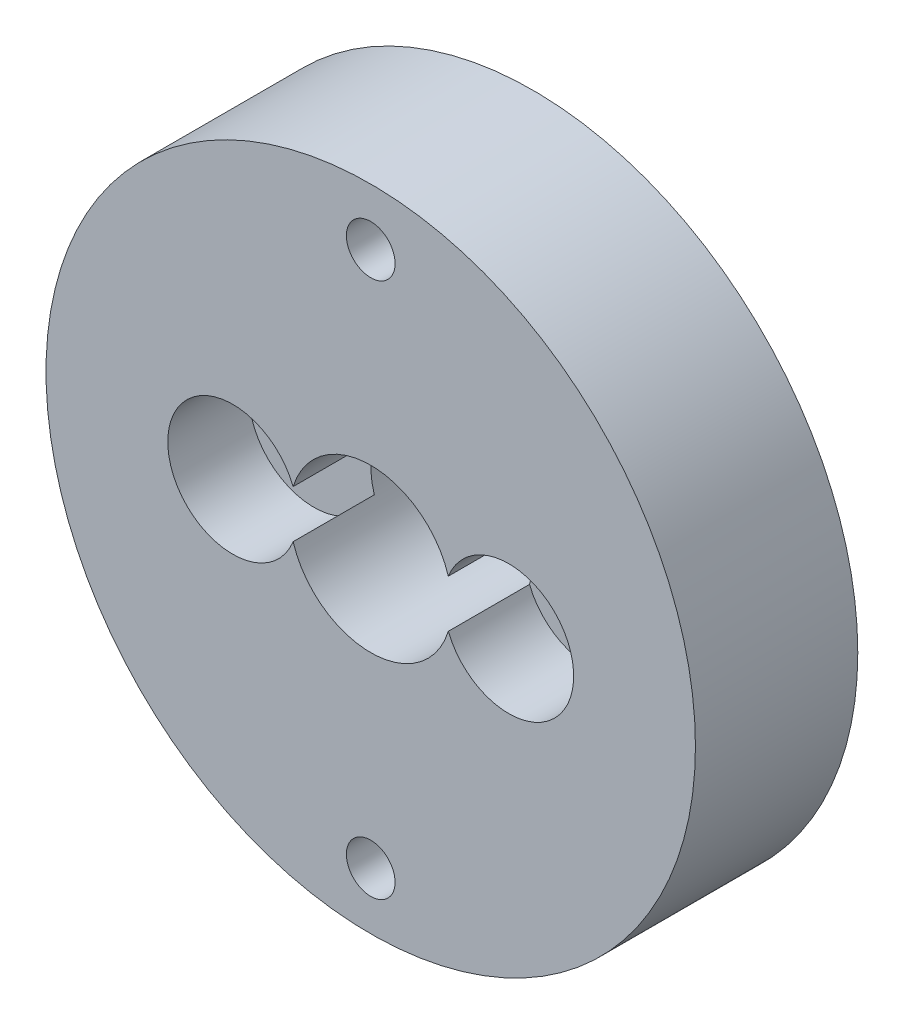
ISO-10303-21;
HEADER;
FILE_DESCRIPTION(('STEP AP214'),'2;1');
FILE_NAME('part.step','',(''),(''),'','','');
FILE_SCHEMA(('AUTOMOTIVE_DESIGN { 1 0 10303 214 1 1 1 1 }'));
ENDSEC;
DATA;
#1=APPLICATION_CONTEXT('core data for automotive mechanical design processes');
#2=APPLICATION_PROTOCOL_DEFINITION('international standard','automotive_design',2000,#1);
#3=PRODUCT_CONTEXT('',#1,'mechanical');
#4=PRODUCT('Part','Part','',(#3));
#5=PRODUCT_RELATED_PRODUCT_CATEGORY('part','',(#4));
#6=PRODUCT_DEFINITION_FORMATION('','',#4);
#7=PRODUCT_DEFINITION_CONTEXT('part definition',#1,'design');
#8=PRODUCT_DEFINITION('design','',#6,#7);
#9=PRODUCT_DEFINITION_SHAPE('','',#8);
#10=(LENGTH_UNIT() NAMED_UNIT(*) SI_UNIT(.MILLI.,.METRE.));
#11=(NAMED_UNIT(*) PLANE_ANGLE_UNIT() SI_UNIT($,.RADIAN.));
#12=(NAMED_UNIT(*) SI_UNIT($,.STERADIAN.) SOLID_ANGLE_UNIT());
#13=UNCERTAINTY_MEASURE_WITH_UNIT(LENGTH_MEASURE(1.E-05),#10,'distance_accuracy_value','');
#14=(GEOMETRIC_REPRESENTATION_CONTEXT(3) GLOBAL_UNCERTAINTY_ASSIGNED_CONTEXT((#13)) GLOBAL_UNIT_ASSIGNED_CONTEXT((#10,
#11,#12)) REPRESENTATION_CONTEXT('',''));
#15=CARTESIAN_POINT('',(0.,0.,0.));
#16=DIRECTION('',(0.,0.,1.));
#17=DIRECTION('',(1.,0.,0.));
#18=AXIS2_PLACEMENT_3D('',#15,#16,#17);
#19=CARTESIAN_POINT('',(-8.5,0.,10.));
#20=DIRECTION('',(0.,0.,-1.));
#21=DIRECTION('',(-1.,0.,0.));
#22=AXIS2_PLACEMENT_3D('',#19,#20,#21);
#23=CYLINDRICAL_SURFACE('',#22,1.25);
#24=CARTESIAN_POINT('',(-8.5,0.,0.));
#25=DIRECTION('',(0.,0.,1.));
#26=DIRECTION('',(1.,0.,0.));
#27=AXIS2_PLACEMENT_3D('',#24,#25,#26);
#28=CIRCLE('',#27,1.25);
#29=CARTESIAN_POINT('',(-7.25,0.,0.));
#30=VERTEX_POINT('',#29);
#31=EDGE_CURVE('E110',#30,#30,#28,.T.);
#32=ORIENTED_EDGE('',*,*,#31,.F.);
#33=EDGE_LOOP('',(#32));
#34=FACE_BOUND('',#33,.T.);
#35=CARTESIAN_POINT('',(-8.5,0.,5.));
#36=DIRECTION('',(0.,0.,1.));
#37=DIRECTION('',(1.,0.,0.));
#38=AXIS2_PLACEMENT_3D('',#35,#36,#37);
#39=CIRCLE('',#38,1.25);
#40=CARTESIAN_POINT('',(-7.25,0.,5.));
#41=VERTEX_POINT('',#40);
#42=EDGE_CURVE('E185',#41,#41,#39,.T.);
#43=ORIENTED_EDGE('',*,*,#42,.T.);
#44=EDGE_LOOP('',(#43));
#45=FACE_BOUND('',#44,.T.);
#46=ADVANCED_FACE('F41',(#34,#45),#23,.F.);
#47=CARTESIAN_POINT('',(8.5,0.,10.));
#48=DIRECTION('',(0.,0.,-1.));
#49=DIRECTION('',(-1.,0.,0.));
#50=AXIS2_PLACEMENT_3D('',#47,#48,#49);
#51=CYLINDRICAL_SURFACE('',#50,1.25);
#52=CARTESIAN_POINT('',(8.5,0.,0.));
#53=DIRECTION('',(0.,0.,1.));
#54=DIRECTION('',(1.,0.,0.));
#55=AXIS2_PLACEMENT_3D('',#52,#53,#54);
#56=CIRCLE('',#55,1.25);
#57=CARTESIAN_POINT('',(9.75,0.,0.));
#58=VERTEX_POINT('',#57);
#59=EDGE_CURVE('E107',#58,#58,#56,.T.);
#60=ORIENTED_EDGE('',*,*,#59,.F.);
#61=EDGE_LOOP('',(#60));
#62=FACE_BOUND('',#61,.T.);
#63=CARTESIAN_POINT('',(8.5,0.,5.));
#64=DIRECTION('',(0.,0.,1.));
#65=DIRECTION('',(1.,0.,0.));
#66=AXIS2_PLACEMENT_3D('',#63,#64,#65);
#67=CIRCLE('',#66,1.25);
#68=CARTESIAN_POINT('',(9.75,0.,5.));
#69=VERTEX_POINT('',#68);
#70=EDGE_CURVE('E180',#69,#69,#67,.T.);
#71=ORIENTED_EDGE('',*,*,#70,.T.);
#72=EDGE_LOOP('',(#71));
#73=FACE_BOUND('',#72,.T.);
#74=ADVANCED_FACE('F144',(#62,#73),#51,.F.);
#75=CARTESIAN_POINT('',(0.,0.,10.));
#76=DIRECTION('',(0.,0.,1.));
#77=DIRECTION('',(1.,0.,0.));
#78=AXIS2_PLACEMENT_3D('',#75,#76,#77);
#79=PLANE('',#78);
#80=CARTESIAN_POINT('',(8.5,0.,10.));
#81=DIRECTION('',(0.,0.,1.));
#82=DIRECTION('',(1.,0.,0.));
#83=AXIS2_PLACEMENT_3D('',#80,#81,#82);
#84=CIRCLE('',#83,4.);
#85=CARTESIAN_POINT('',(4.77941176470588,-1.46874884966457,10.));
#86=VERTEX_POINT('',#85);
#87=CARTESIAN_POINT('',(4.77941176470588,1.46874884966457,10.));
#88=VERTEX_POINT('',#87);
#89=EDGE_CURVE('E100',#86,#88,#84,.T.);
#90=ORIENTED_EDGE('',*,*,#89,.F.);
#91=CARTESIAN_POINT('',(0.,0.,10.));
#92=DIRECTION('',(0.,0.,1.));
#93=DIRECTION('',(1.,0.,0.));
#94=AXIS2_PLACEMENT_3D('',#91,#92,#93);
#95=CIRCLE('',#94,5.);
#96=CARTESIAN_POINT('',(-4.77941176470588,-1.46874884966457,10.));
#97=VERTEX_POINT('',#96);
#98=EDGE_CURVE('E99',#97,#86,#95,.T.);
#99=ORIENTED_EDGE('',*,*,#98,.F.);
#100=CARTESIAN_POINT('',(-8.5,0.,10.));
#101=DIRECTION('',(0.,0.,1.));
#102=DIRECTION('',(1.,0.,0.));
#103=AXIS2_PLACEMENT_3D('',#100,#101,#102);
#104=CIRCLE('',#103,4.);
#105=CARTESIAN_POINT('',(-4.77941176470588,1.46874884966457,10.));
#106=VERTEX_POINT('',#105);
#107=EDGE_CURVE('E83',#106,#97,#104,.T.);
#108=ORIENTED_EDGE('',*,*,#107,.F.);
#109=EDGE_CURVE('E97',#88,#106,#95,.T.);
#110=ORIENTED_EDGE('',*,*,#109,.F.);
#111=EDGE_LOOP('',(#90,#99,#108,#110));
#112=FACE_BOUND('',#111,.T.);
#113=CARTESIAN_POINT('',(0.,-16.5,10.));
#114=DIRECTION('',(0.,0.,1.));
#115=DIRECTION('',(1.,0.,0.));
#116=AXIS2_PLACEMENT_3D('',#113,#114,#115);
#117=CIRCLE('',#116,1.5);
#118=CARTESIAN_POINT('',(1.50000000000001,-16.5,10.));
#119=VERTEX_POINT('',#118);
#120=EDGE_CURVE('E118',#119,#119,#117,.T.);
#121=ORIENTED_EDGE('',*,*,#120,.F.);
#122=EDGE_LOOP('',(#121));
#123=FACE_BOUND('',#122,.T.);
#124=CARTESIAN_POINT('',(0.,0.,10.));
#125=DIRECTION('',(0.,0.,1.));
#126=DIRECTION('',(1.,0.,0.));
#127=AXIS2_PLACEMENT_3D('',#124,#125,#126);
#128=CIRCLE('',#127,20.);
#129=CARTESIAN_POINT('',(20.,0.,10.));
#130=VERTEX_POINT('',#129);
#131=EDGE_CURVE('E123',#130,#130,#128,.T.);
#132=ORIENTED_EDGE('',*,*,#131,.T.);
#133=EDGE_LOOP('',(#132));
#134=FACE_BOUND('',#133,.T.);
#135=CARTESIAN_POINT('',(0.,16.5,10.));
#136=DIRECTION('',(0.,0.,1.));
#137=DIRECTION('',(1.,0.,0.));
#138=AXIS2_PLACEMENT_3D('',#135,#136,#137);
#139=CIRCLE('',#138,1.5);
#140=CARTESIAN_POINT('',(1.5,16.5,10.));
#141=VERTEX_POINT('',#140);
#142=EDGE_CURVE('E179',#141,#141,#139,.T.);
#143=ORIENTED_EDGE('',*,*,#142,.F.);
#144=EDGE_LOOP('',(#143));
#145=FACE_BOUND('',#144,.T.);
#146=ADVANCED_FACE('F95',(#112,#123,#134,#145),#79,.T.);
#147=CARTESIAN_POINT('',(0.,0.,0.));
#148=DIRECTION('',(0.,0.,1.));
#149=DIRECTION('',(1.,0.,0.));
#150=AXIS2_PLACEMENT_3D('',#147,#148,#149);
#151=PLANE('',#150);
#152=CARTESIAN_POINT('',(0.,0.,0.));
#153=DIRECTION('',(0.,0.,1.));
#154=DIRECTION('',(1.,0.,0.));
#155=AXIS2_PLACEMENT_3D('',#152,#153,#154);
#156=CIRCLE('',#155,20.);
#157=CARTESIAN_POINT('',(20.,0.,0.));
#158=VERTEX_POINT('',#157);
#159=EDGE_CURVE('E122',#158,#158,#156,.T.);
#160=ORIENTED_EDGE('',*,*,#159,.F.);
#161=EDGE_LOOP('',(#160));
#162=FACE_BOUND('',#161,.T.);
#163=ORIENTED_EDGE('',*,*,#31,.T.);
#164=EDGE_LOOP('',(#163));
#165=FACE_BOUND('',#164,.T.);
#166=ORIENTED_EDGE('',*,*,#59,.T.);
#167=EDGE_LOOP('',(#166));
#168=FACE_BOUND('',#167,.T.);
#169=CARTESIAN_POINT('',(0.,0.,0.));
#170=DIRECTION('',(0.,0.,1.));
#171=DIRECTION('',(1.,0.,0.));
#172=AXIS2_PLACEMENT_3D('',#169,#170,#171);
#173=CIRCLE('',#172,5.);
#174=CARTESIAN_POINT('',(5.,0.,0.));
#175=VERTEX_POINT('',#174);
#176=EDGE_CURVE('E112',#175,#175,#173,.T.);
#177=ORIENTED_EDGE('',*,*,#176,.T.);
#178=EDGE_LOOP('',(#177));
#179=FACE_BOUND('',#178,.T.);
#180=CARTESIAN_POINT('',(0.,-16.5,0.));
#181=DIRECTION('',(0.,0.,1.));
#182=DIRECTION('',(1.,0.,0.));
#183=AXIS2_PLACEMENT_3D('',#180,#181,#182);
#184=CIRCLE('',#183,1.5);
#185=CARTESIAN_POINT('',(1.50000000000001,-16.5,0.));
#186=VERTEX_POINT('',#185);
#187=EDGE_CURVE('E115',#186,#186,#184,.T.);
#188=ORIENTED_EDGE('',*,*,#187,.T.);
#189=EDGE_LOOP('',(#188));
#190=FACE_BOUND('',#189,.T.);
#191=CARTESIAN_POINT('',(0.,16.5,0.));
#192=DIRECTION('',(0.,0.,1.));
#193=DIRECTION('',(1.,0.,0.));
#194=AXIS2_PLACEMENT_3D('',#191,#192,#193);
#195=CIRCLE('',#194,1.5);
#196=CARTESIAN_POINT('',(1.5,16.5,0.));
#197=VERTEX_POINT('',#196);
#198=EDGE_CURVE('E177',#197,#197,#195,.T.);
#199=ORIENTED_EDGE('',*,*,#198,.T.);
#200=EDGE_LOOP('',(#199));
#201=FACE_BOUND('',#200,.T.);
#202=ADVANCED_FACE('F158',(#162,#165,#168,#179,#190,#201),#151,.F.);
#203=CARTESIAN_POINT('',(0.,0.,10.));
#204=DIRECTION('',(0.,0.,-1.));
#205=DIRECTION('',(-1.,0.,0.));
#206=AXIS2_PLACEMENT_3D('',#203,#204,#205);
#207=CYLINDRICAL_SURFACE('',#206,20.);
#208=ORIENTED_EDGE('',*,*,#131,.F.);
#209=EDGE_LOOP('',(#208));
#210=FACE_BOUND('',#209,.T.);
#211=ORIENTED_EDGE('',*,*,#159,.T.);
#212=EDGE_LOOP('',(#211));
#213=FACE_BOUND('',#212,.T.);
#214=ADVANCED_FACE('F43',(#210,#213),#207,.T.);
#215=CARTESIAN_POINT('',(0.,0.,10.));
#216=DIRECTION('',(0.,0.,-1.));
#217=DIRECTION('',(-1.,0.,0.));
#218=AXIS2_PLACEMENT_3D('',#215,#216,#217);
#219=CYLINDRICAL_SURFACE('',#218,5.);
#220=DIRECTION('',(0.,0.,1.));
#221=VECTOR('',#220,1.);
#222=CARTESIAN_POINT('',(4.77941176470588,-1.46874884966457,7.5));
#223=LINE('',#222,#221);
#224=CARTESIAN_POINT('',(4.77941176470588,-1.46874884966457,5.));
#225=VERTEX_POINT('',#224);
#226=EDGE_CURVE('E11',#225,#86,#223,.T.);
#227=ORIENTED_EDGE('',*,*,#226,.F.);
#228=CARTESIAN_POINT('',(0.,0.,5.));
#229=DIRECTION('',(0.,0.,1.));
#230=DIRECTION('',(1.,0.,0.));
#231=AXIS2_PLACEMENT_3D('',#228,#229,#230);
#232=CIRCLE('',#231,5.);
#233=CARTESIAN_POINT('',(4.77941176470588,1.46874884966457,5.));
#234=VERTEX_POINT('',#233);
#235=EDGE_CURVE('E88',#225,#234,#232,.T.);
#236=ORIENTED_EDGE('',*,*,#235,.T.);
#237=DIRECTION('',(0.,0.,1.));
#238=VECTOR('',#237,1.);
#239=CARTESIAN_POINT('',(4.77941176470588,1.46874884966457,7.5));
#240=LINE('',#239,#238);
#241=EDGE_CURVE('E49',#88,#234,#240,.F.);
#242=ORIENTED_EDGE('',*,*,#241,.F.);
#243=ORIENTED_EDGE('',*,*,#109,.T.);
#244=DIRECTION('',(0.,0.,1.));
#245=VECTOR('',#244,1.);
#246=CARTESIAN_POINT('',(-4.77941176470588,1.46874884966457,7.5));
#247=LINE('',#246,#245);
#248=CARTESIAN_POINT('',(-4.77941176470588,1.46874884966457,5.));
#249=VERTEX_POINT('',#248);
#250=EDGE_CURVE('E80',#249,#106,#247,.T.);
#251=ORIENTED_EDGE('',*,*,#250,.F.);
#252=CARTESIAN_POINT('',(0.,0.,5.));
#253=DIRECTION('',(0.,0.,1.));
#254=DIRECTION('',(1.,0.,0.));
#255=AXIS2_PLACEMENT_3D('',#252,#253,#254);
#256=CIRCLE('',#255,5.);
#257=CARTESIAN_POINT('',(-4.77941176470588,-1.46874884966457,5.));
#258=VERTEX_POINT('',#257);
#259=EDGE_CURVE('E126',#249,#258,#256,.T.);
#260=ORIENTED_EDGE('',*,*,#259,.T.);
#261=DIRECTION('',(0.,0.,1.));
#262=VECTOR('',#261,1.);
#263=CARTESIAN_POINT('',(-4.77941176470588,-1.46874884966457,7.5));
#264=LINE('',#263,#262);
#265=EDGE_CURVE('E89',#97,#258,#264,.F.);
#266=ORIENTED_EDGE('',*,*,#265,.F.);
#267=ORIENTED_EDGE('',*,*,#98,.T.);
#268=EDGE_LOOP('',(#227,#236,#242,#243,#251,#260,#266,#267));
#269=FACE_BOUND('',#268,.T.);
#270=ORIENTED_EDGE('',*,*,#176,.F.);
#271=EDGE_LOOP('',(#270));
#272=FACE_BOUND('',#271,.T.);
#273=ADVANCED_FACE('F104',(#269,#272),#219,.F.);
#274=CARTESIAN_POINT('',(0.,-16.5,10.));
#275=DIRECTION('',(0.,0.,-1.));
#276=DIRECTION('',(-1.,0.,0.));
#277=AXIS2_PLACEMENT_3D('',#274,#275,#276);
#278=CYLINDRICAL_SURFACE('',#277,1.5);
#279=ORIENTED_EDGE('',*,*,#120,.T.);
#280=EDGE_LOOP('',(#279));
#281=FACE_BOUND('',#280,.T.);
#282=ORIENTED_EDGE('',*,*,#187,.F.);
#283=EDGE_LOOP('',(#282));
#284=FACE_BOUND('',#283,.T.);
#285=ADVANCED_FACE('F190',(#281,#284),#278,.F.);
#286=CARTESIAN_POINT('',(0.,16.5,10.));
#287=DIRECTION('',(0.,0.,-1.));
#288=DIRECTION('',(-1.,0.,0.));
#289=AXIS2_PLACEMENT_3D('',#286,#287,#288);
#290=CYLINDRICAL_SURFACE('',#289,1.5);
#291=ORIENTED_EDGE('',*,*,#142,.T.);
#292=EDGE_LOOP('',(#291));
#293=FACE_BOUND('',#292,.T.);
#294=ORIENTED_EDGE('',*,*,#198,.F.);
#295=EDGE_LOOP('',(#294));
#296=FACE_BOUND('',#295,.T.);
#297=ADVANCED_FACE('F197',(#293,#296),#290,.F.);
#298=CARTESIAN_POINT('',(-8.5,0.,5.));
#299=DIRECTION('',(0.,0.,1.));
#300=DIRECTION('',(1.,0.,0.));
#301=AXIS2_PLACEMENT_3D('',#298,#299,#300);
#302=CYLINDRICAL_SURFACE('',#301,4.);
#303=ORIENTED_EDGE('',*,*,#250,.T.);
#304=ORIENTED_EDGE('',*,*,#107,.T.);
#305=ORIENTED_EDGE('',*,*,#265,.T.);
#306=CARTESIAN_POINT('',(-8.5,0.,5.));
#307=DIRECTION('',(0.,0.,1.));
#308=DIRECTION('',(1.,0.,0.));
#309=AXIS2_PLACEMENT_3D('',#306,#307,#308);
#310=CIRCLE('',#309,4.);
#311=EDGE_CURVE('E62',#249,#258,#310,.T.);
#312=ORIENTED_EDGE('',*,*,#311,.F.);
#313=EDGE_LOOP('',(#303,#304,#305,#312));
#314=FACE_BOUND('',#313,.T.);
#315=ADVANCED_FACE('F82',(#314),#302,.F.);
#316=CARTESIAN_POINT('',(-8.5,0.,5.));
#317=DIRECTION('',(0.,0.,1.));
#318=DIRECTION('',(1.,0.,0.));
#319=AXIS2_PLACEMENT_3D('',#316,#317,#318);
#320=PLANE('',#319);
#321=ORIENTED_EDGE('',*,*,#42,.F.);
#322=EDGE_LOOP('',(#321));
#323=FACE_BOUND('',#322,.T.);
#324=ORIENTED_EDGE('',*,*,#311,.T.);
#325=ORIENTED_EDGE('',*,*,#259,.F.);
#326=EDGE_LOOP('',(#324,#325));
#327=FACE_BOUND('',#326,.T.);
#328=ADVANCED_FACE('F140',(#323,#327),#320,.T.);
#329=CARTESIAN_POINT('',(8.5,0.,5.));
#330=DIRECTION('',(0.,0.,1.));
#331=DIRECTION('',(1.,0.,0.));
#332=AXIS2_PLACEMENT_3D('',#329,#330,#331);
#333=CYLINDRICAL_SURFACE('',#332,4.);
#334=ORIENTED_EDGE('',*,*,#226,.T.);
#335=ORIENTED_EDGE('',*,*,#89,.T.);
#336=ORIENTED_EDGE('',*,*,#241,.T.);
#337=CARTESIAN_POINT('',(8.5,0.,5.));
#338=DIRECTION('',(0.,0.,1.));
#339=DIRECTION('',(1.,0.,0.));
#340=AXIS2_PLACEMENT_3D('',#337,#338,#339);
#341=CIRCLE('',#340,4.);
#342=EDGE_CURVE('E55',#225,#234,#341,.T.);
#343=ORIENTED_EDGE('',*,*,#342,.F.);
#344=EDGE_LOOP('',(#334,#335,#336,#343));
#345=FACE_BOUND('',#344,.T.);
#346=ADVANCED_FACE('F132',(#345),#333,.F.);
#347=CARTESIAN_POINT('',(8.5,0.,5.));
#348=DIRECTION('',(0.,0.,1.));
#349=DIRECTION('',(1.,0.,0.));
#350=AXIS2_PLACEMENT_3D('',#347,#348,#349);
#351=PLANE('',#350);
#352=ORIENTED_EDGE('',*,*,#70,.F.);
#353=EDGE_LOOP('',(#352));
#354=FACE_BOUND('',#353,.T.);
#355=ORIENTED_EDGE('',*,*,#342,.T.);
#356=ORIENTED_EDGE('',*,*,#235,.F.);
#357=EDGE_LOOP('',(#355,#356));
#358=FACE_BOUND('',#357,.T.);
#359=ADVANCED_FACE('F133',(#354,#358),#351,.T.);
#360=CLOSED_SHELL('',(#46,#74,#146,#202,#214,#273,#285,#297,#315,#328,#346,#359));
#361=MANIFOLD_SOLID_BREP('B2',#360);
#362=ADVANCED_BREP_SHAPE_REPRESENTATION('',(#18,#361),#14);
#363=SHAPE_DEFINITION_REPRESENTATION(#9,#362);
ENDSEC;
END-ISO-10303-21;
